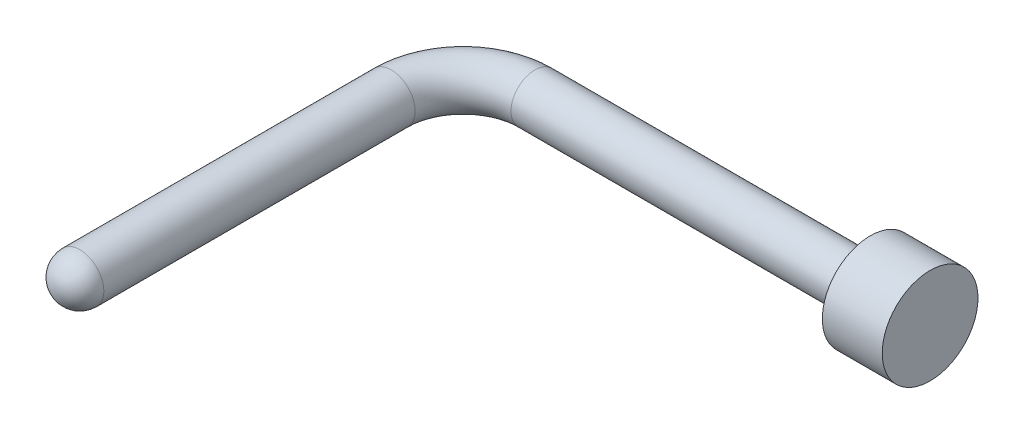
ISO-10303-21;
HEADER;
FILE_DESCRIPTION(('STEP AP214'),'2;1');
FILE_NAME('part.step','',(''),(''),'','','');
FILE_SCHEMA(('AUTOMOTIVE_DESIGN { 1 0 10303 214 1 1 1 1 }'));
ENDSEC;
DATA;
#1=APPLICATION_CONTEXT('core data for automotive mechanical design processes');
#2=APPLICATION_PROTOCOL_DEFINITION('international standard','automotive_design',2000,#1);
#3=PRODUCT_CONTEXT('',#1,'mechanical');
#4=PRODUCT('Part','Part','',(#3));
#5=PRODUCT_RELATED_PRODUCT_CATEGORY('part','',(#4));
#6=PRODUCT_DEFINITION_FORMATION('','',#4);
#7=PRODUCT_DEFINITION_CONTEXT('part definition',#1,'design');
#8=PRODUCT_DEFINITION('design','',#6,#7);
#9=PRODUCT_DEFINITION_SHAPE('','',#8);
#10=(LENGTH_UNIT() NAMED_UNIT(*) SI_UNIT(.MILLI.,.METRE.));
#11=(NAMED_UNIT(*) PLANE_ANGLE_UNIT() SI_UNIT($,.RADIAN.));
#12=(NAMED_UNIT(*) SI_UNIT($,.STERADIAN.) SOLID_ANGLE_UNIT());
#13=UNCERTAINTY_MEASURE_WITH_UNIT(LENGTH_MEASURE(1.E-05),#10,'distance_accuracy_value','');
#14=(GEOMETRIC_REPRESENTATION_CONTEXT(3) GLOBAL_UNCERTAINTY_ASSIGNED_CONTEXT((#13)) GLOBAL_UNIT_ASSIGNED_CONTEXT((#10,
#11,#12)) REPRESENTATION_CONTEXT('',''));
#15=CARTESIAN_POINT('',(0.,0.,0.));
#16=DIRECTION('',(0.,0.,1.));
#17=DIRECTION('',(1.,0.,0.));
#18=AXIS2_PLACEMENT_3D('',#15,#16,#17);
#19=CARTESIAN_POINT('',(0.,0.,17.));
#20=DIRECTION('',(0.,0.,-1.));
#21=DIRECTION('',(-1.,0.,0.));
#22=AXIS2_PLACEMENT_3D('',#19,#20,#21);
#23=CYLINDRICAL_SURFACE('',#22,1.);
#24=CARTESIAN_POINT('',(0.,0.,16.));
#25=DIRECTION('',(0.,0.,-1.));
#26=DIRECTION('',(-1.,0.,0.));
#27=AXIS2_PLACEMENT_3D('',#24,#25,#26);
#28=CIRCLE('',#27,1.);
#29=CARTESIAN_POINT('',(-1.,0.,16.));
#30=VERTEX_POINT('',#29);
#31=EDGE_CURVE('E10',#30,#30,#28,.T.);
#32=ORIENTED_EDGE('',*,*,#31,.T.);
#33=EDGE_LOOP('',(#32));
#34=FACE_BOUND('',#33,.T.);
#35=CARTESIAN_POINT('',(0.,0.,3.));
#36=DIRECTION('',(0.,0.,-1.));
#37=DIRECTION('',(-1.,0.,0.));
#38=AXIS2_PLACEMENT_3D('',#35,#36,#37);
#39=CIRCLE('',#38,1.);
#40=CARTESIAN_POINT('',(-1.,0.,3.));
#41=VERTEX_POINT('',#40);
#42=EDGE_CURVE('E52',#41,#41,#39,.T.);
#43=ORIENTED_EDGE('',*,*,#42,.F.);
#44=EDGE_LOOP('',(#43));
#45=FACE_BOUND('',#44,.T.);
#46=ADVANCED_FACE('F37',(#34,#45),#23,.T.);
#47=CARTESIAN_POINT('',(3.,0.,3.));
#48=DIRECTION('',(0.,-1.,0.));
#49=DIRECTION('',(0.,0.,-1.));
#50=AXIS2_PLACEMENT_3D('',#47,#48,#49);
#51=TOROIDAL_SURFACE('',#50,3.,1.);
#52=CARTESIAN_POINT('',(3.,0.,0.));
#53=DIRECTION('',(1.,0.,0.));
#54=DIRECTION('',(0.,0.,-1.));
#55=AXIS2_PLACEMENT_3D('',#52,#53,#54);
#56=CIRCLE('',#55,1.);
#57=CARTESIAN_POINT('',(3.,0.,-1.));
#58=VERTEX_POINT('',#57);
#59=EDGE_CURVE('E48',#58,#58,#56,.T.);
#60=CARTESIAN_POINT('',(3.,0.,3.));
#61=DIRECTION('',(0.,-1.,0.));
#62=DIRECTION('',(0.,0.,-1.));
#63=AXIS2_PLACEMENT_3D('',#60,#61,#62);
#64=CIRCLE('',#63,4.);
#65=EDGE_CURVE('',#41,#58,#64,.T.);
#66=ORIENTED_EDGE('',*,*,#42,.T.);
#67=ORIENTED_EDGE('',*,*,#59,.F.);
#68=ORIENTED_EDGE('',*,*,#65,.T.);
#69=ORIENTED_EDGE('',*,*,#65,.F.);
#70=EDGE_LOOP('',(#66,#68,#67,#69));
#71=FACE_BOUND('',#70,.T.);
#72=ADVANCED_FACE('F81',(#71),#51,.T.);
#73=CARTESIAN_POINT('',(3.,0.,0.));
#74=DIRECTION('',(1.,0.,0.));
#75=DIRECTION('',(0.,0.,-1.));
#76=AXIS2_PLACEMENT_3D('',#73,#74,#75);
#77=CYLINDRICAL_SURFACE('',#76,1.);
#78=CARTESIAN_POINT('',(17.,0.,0.));
#79=DIRECTION('',(1.,0.,0.));
#80=DIRECTION('',(0.,0.,-1.));
#81=AXIS2_PLACEMENT_3D('',#78,#79,#80);
#82=CIRCLE('',#81,1.);
#83=CARTESIAN_POINT('',(17.,0.,-1.));
#84=VERTEX_POINT('',#83);
#85=EDGE_CURVE('E44',#84,#84,#82,.T.);
#86=ORIENTED_EDGE('',*,*,#85,.F.);
#87=EDGE_LOOP('',(#86));
#88=FACE_BOUND('',#87,.T.);
#89=ORIENTED_EDGE('',*,*,#59,.T.);
#90=EDGE_LOOP('',(#89));
#91=FACE_BOUND('',#90,.T.);
#92=ADVANCED_FACE('F79',(#88,#91),#77,.T.);
#93=CARTESIAN_POINT('',(0.,0.,16.));
#94=DIRECTION('',(0.,0.,-1.));
#95=DIRECTION('',(-1.,0.,0.));
#96=AXIS2_PLACEMENT_3D('',#93,#94,#95);
#97=SPHERICAL_SURFACE('',#96,1.);
#98=ORIENTED_EDGE('',*,*,#31,.F.);
#99=EDGE_LOOP('',(#98));
#100=FACE_BOUND('',#99,.T.);
#101=ADVANCED_FACE('F39',(#100),#97,.T.);
#102=CARTESIAN_POINT('',(19.5,0.,0.));
#103=DIRECTION('',(-1.,0.,0.));
#104=DIRECTION('',(0.,0.,1.));
#105=AXIS2_PLACEMENT_3D('',#102,#103,#104);
#106=CYLINDRICAL_SURFACE('',#105,2.);
#107=CARTESIAN_POINT('',(19.5,0.,0.));
#108=DIRECTION('',(1.,0.,0.));
#109=DIRECTION('',(0.,0.,-1.));
#110=AXIS2_PLACEMENT_3D('',#107,#108,#109);
#111=CIRCLE('',#110,2.);
#112=CARTESIAN_POINT('',(19.5,0.,-2.));
#113=VERTEX_POINT('',#112);
#114=EDGE_CURVE('E57',#113,#113,#111,.T.);
#115=ORIENTED_EDGE('',*,*,#114,.F.);
#116=EDGE_LOOP('',(#115));
#117=FACE_BOUND('',#116,.T.);
#118=CARTESIAN_POINT('',(17.,0.,0.));
#119=DIRECTION('',(1.,0.,0.));
#120=DIRECTION('',(0.,0.,-1.));
#121=AXIS2_PLACEMENT_3D('',#118,#119,#120);
#122=CIRCLE('',#121,2.);
#123=CARTESIAN_POINT('',(17.,0.,-2.));
#124=VERTEX_POINT('',#123);
#125=EDGE_CURVE('E58',#124,#124,#122,.T.);
#126=ORIENTED_EDGE('',*,*,#125,.T.);
#127=EDGE_LOOP('',(#126));
#128=FACE_BOUND('',#127,.T.);
#129=ADVANCED_FACE('F66',(#117,#128),#106,.T.);
#130=CARTESIAN_POINT('',(19.5,0.,0.));
#131=DIRECTION('',(1.,0.,0.));
#132=DIRECTION('',(0.,0.,-1.));
#133=AXIS2_PLACEMENT_3D('',#130,#131,#132);
#134=PLANE('',#133);
#135=ORIENTED_EDGE('',*,*,#114,.T.);
#136=EDGE_LOOP('',(#135));
#137=FACE_BOUND('',#136,.T.);
#138=ADVANCED_FACE('F64',(#137),#134,.T.);
#139=CARTESIAN_POINT('',(17.,0.,0.));
#140=DIRECTION('',(1.,0.,0.));
#141=DIRECTION('',(0.,0.,-1.));
#142=AXIS2_PLACEMENT_3D('',#139,#140,#141);
#143=PLANE('',#142);
#144=ORIENTED_EDGE('',*,*,#85,.T.);
#145=EDGE_LOOP('',(#144));
#146=FACE_BOUND('',#145,.T.);
#147=ORIENTED_EDGE('',*,*,#125,.F.);
#148=EDGE_LOOP('',(#147));
#149=FACE_BOUND('',#148,.T.);
#150=ADVANCED_FACE('F72',(#146,#149),#143,.F.);
#151=CLOSED_SHELL('',(#46,#72,#92,#101,#129,#138,#150));
#152=MANIFOLD_SOLID_BREP('B2',#151);
#153=ADVANCED_BREP_SHAPE_REPRESENTATION('',(#18,#152),#14);
#154=SHAPE_DEFINITION_REPRESENTATION(#9,#153);
ENDSEC;
END-ISO-10303-21;
